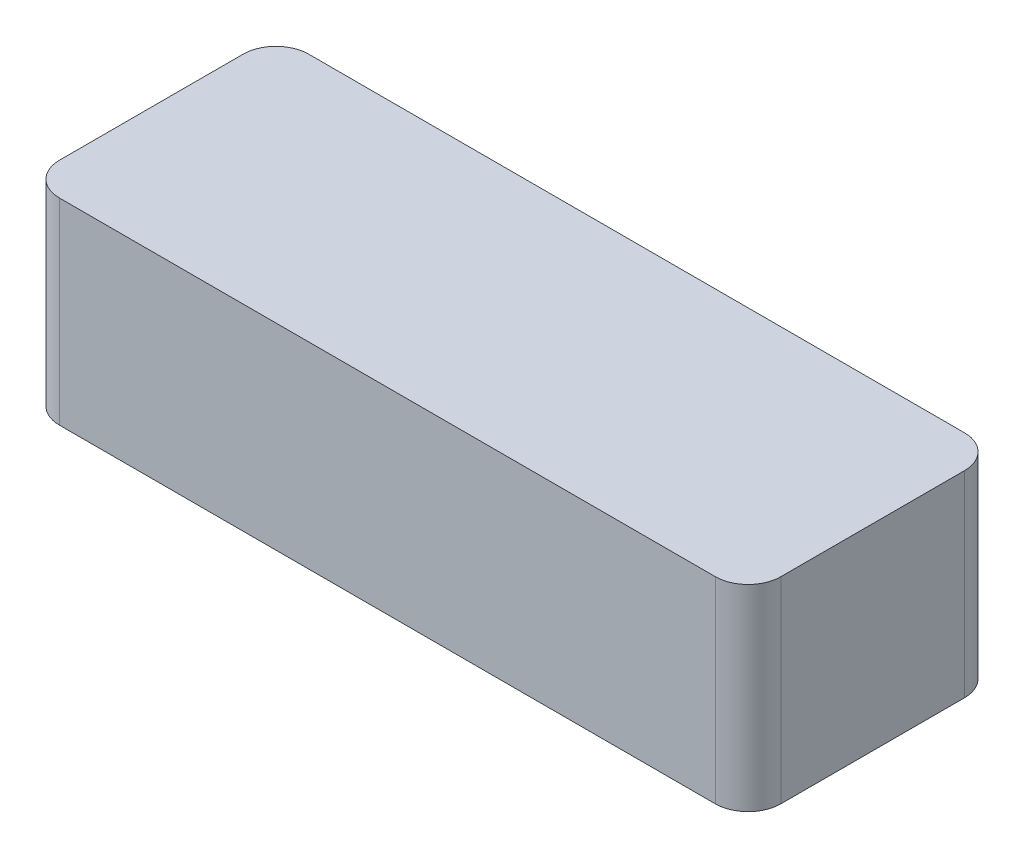
ISO-10303-21;
HEADER;
FILE_DESCRIPTION(('STEP AP214'),'2;1');
FILE_NAME('part.step','',(''),(''),'','','');
FILE_SCHEMA(('AUTOMOTIVE_DESIGN { 1 0 10303 214 1 1 1 1 }'));
ENDSEC;
DATA;
#1=APPLICATION_CONTEXT('core data for automotive mechanical design processes');
#2=APPLICATION_PROTOCOL_DEFINITION('international standard','automotive_design',2000,#1);
#3=PRODUCT_CONTEXT('',#1,'mechanical');
#4=PRODUCT('Part','Part','',(#3));
#5=PRODUCT_RELATED_PRODUCT_CATEGORY('part','',(#4));
#6=PRODUCT_DEFINITION_FORMATION('','',#4);
#7=PRODUCT_DEFINITION_CONTEXT('part definition',#1,'design');
#8=PRODUCT_DEFINITION('design','',#6,#7);
#9=PRODUCT_DEFINITION_SHAPE('','',#8);
#10=(LENGTH_UNIT() NAMED_UNIT(*) SI_UNIT(.MILLI.,.METRE.));
#11=(NAMED_UNIT(*) PLANE_ANGLE_UNIT() SI_UNIT($,.RADIAN.));
#12=(NAMED_UNIT(*) SI_UNIT($,.STERADIAN.) SOLID_ANGLE_UNIT());
#13=UNCERTAINTY_MEASURE_WITH_UNIT(LENGTH_MEASURE(1.E-05),#10,'distance_accuracy_value','');
#14=(GEOMETRIC_REPRESENTATION_CONTEXT(3) GLOBAL_UNCERTAINTY_ASSIGNED_CONTEXT((#13)) GLOBAL_UNIT_ASSIGNED_CONTEXT((#10,
#11,#12)) REPRESENTATION_CONTEXT('',''));
#15=CARTESIAN_POINT('',(0.,0.,0.));
#16=DIRECTION('',(0.,0.,1.));
#17=DIRECTION('',(1.,0.,0.));
#18=AXIS2_PLACEMENT_3D('',#15,#16,#17);
#19=CARTESIAN_POINT('',(-41.8004365761796,30.,9.48570595099183));
#20=DIRECTION('',(0.,-1.,0.));
#21=DIRECTION('',(0.,0.,-1.));
#22=AXIS2_PLACEMENT_3D('',#19,#20,#21);
#23=CYLINDRICAL_SURFACE('',#22,5.);
#24=CARTESIAN_POINT('',(-41.8004365761796,0.,9.48570595099183));
#25=DIRECTION('',(0.,1.,0.));
#26=DIRECTION('',(0.,0.,-1.));
#27=AXIS2_PLACEMENT_3D('',#24,#25,#26);
#28=CIRCLE('',#27,5.);
#29=CARTESIAN_POINT('',(-46.8004365761796,0.,9.48570595099179));
#30=VERTEX_POINT('',#29);
#31=CARTESIAN_POINT('',(-41.8004365761795,0.,14.4857059509918));
#32=VERTEX_POINT('',#31);
#33=EDGE_CURVE('E146',#30,#32,#28,.T.);
#34=ORIENTED_EDGE('',*,*,#33,.T.);
#35=DIRECTION('',(0.,-1.,0.));
#36=VECTOR('',#35,1.);
#37=CARTESIAN_POINT('',(-41.8004365761795,30.,14.4857059509918));
#38=LINE('',#37,#36);
#39=CARTESIAN_POINT('',(-41.8004365761795,30.,14.4857059509918));
#40=VERTEX_POINT('',#39);
#41=EDGE_CURVE('E11',#40,#32,#38,.T.);
#42=ORIENTED_EDGE('',*,*,#41,.F.);
#43=CARTESIAN_POINT('',(-41.8004365761796,30.,9.48570595099183));
#44=DIRECTION('',(0.,1.,0.));
#45=DIRECTION('',(0.,0.,-1.));
#46=AXIS2_PLACEMENT_3D('',#43,#44,#45);
#47=CIRCLE('',#46,5.);
#48=CARTESIAN_POINT('',(-46.8004365761796,30.,9.48570595099179));
#49=VERTEX_POINT('',#48);
#50=EDGE_CURVE('E168',#49,#40,#47,.T.);
#51=ORIENTED_EDGE('',*,*,#50,.F.);
#52=DIRECTION('',(0.,-1.,0.));
#53=VECTOR('',#52,1.);
#54=CARTESIAN_POINT('',(-46.8004365761796,30.,9.48570595099179));
#55=LINE('',#54,#53);
#56=EDGE_CURVE('E142',#49,#30,#55,.T.);
#57=ORIENTED_EDGE('',*,*,#56,.T.);
#58=EDGE_LOOP('',(#34,#42,#51,#57));
#59=FACE_BOUND('',#58,.T.);
#60=ADVANCED_FACE('F45',(#59),#23,.T.);
#61=CARTESIAN_POINT('',(-41.8004365761795,30.,14.4857059509918));
#62=DIRECTION('',(0.,0.,-1.));
#63=DIRECTION('',(-1.,0.,0.));
#64=AXIS2_PLACEMENT_3D('',#61,#62,#63);
#65=PLANE('',#64);
#66=DIRECTION('',(1.,0.,0.));
#67=VECTOR('',#66,1.);
#68=CARTESIAN_POINT('',(-41.8004365761795,0.,14.4857059509918));
#69=LINE('',#68,#67);
#70=CARTESIAN_POINT('',(58.1995634238204,0.,14.4857059509918));
#71=VERTEX_POINT('',#70);
#72=EDGE_CURVE('E150',#32,#71,#69,.T.);
#73=ORIENTED_EDGE('',*,*,#72,.T.);
#74=DIRECTION('',(0.,-1.,0.));
#75=VECTOR('',#74,1.);
#76=CARTESIAN_POINT('',(58.1995634238204,30.,14.4857059509918));
#77=LINE('',#76,#75);
#78=CARTESIAN_POINT('',(58.1995634238204,30.,14.4857059509918));
#79=VERTEX_POINT('',#78);
#80=EDGE_CURVE('E54',#79,#71,#77,.T.);
#81=ORIENTED_EDGE('',*,*,#80,.F.);
#82=DIRECTION('',(1.,0.,0.));
#83=VECTOR('',#82,1.);
#84=CARTESIAN_POINT('',(-41.8004365761795,30.,14.4857059509918));
#85=LINE('',#84,#83);
#86=EDGE_CURVE('E105',#40,#79,#85,.T.);
#87=ORIENTED_EDGE('',*,*,#86,.F.);
#88=ORIENTED_EDGE('',*,*,#41,.T.);
#89=EDGE_LOOP('',(#73,#81,#87,#88));
#90=FACE_BOUND('',#89,.T.);
#91=ADVANCED_FACE('F214',(#90),#65,.F.);
#92=CARTESIAN_POINT('',(58.1995634238204,30.,9.48570595099183));
#93=DIRECTION('',(0.,-1.,0.));
#94=DIRECTION('',(0.,0.,-1.));
#95=AXIS2_PLACEMENT_3D('',#92,#93,#94);
#96=CYLINDRICAL_SURFACE('',#95,5.);
#97=CARTESIAN_POINT('',(58.1995634238204,0.,9.48570595099183));
#98=DIRECTION('',(0.,1.,0.));
#99=DIRECTION('',(0.,0.,1.));
#100=AXIS2_PLACEMENT_3D('',#97,#98,#99);
#101=CIRCLE('',#100,5.);
#102=CARTESIAN_POINT('',(63.1995634238204,0.,9.48570595099183));
#103=VERTEX_POINT('',#102);
#104=EDGE_CURVE('E153',#71,#103,#101,.T.);
#105=ORIENTED_EDGE('',*,*,#104,.T.);
#106=DIRECTION('',(0.,-1.,0.));
#107=VECTOR('',#106,1.);
#108=CARTESIAN_POINT('',(63.1995634238204,30.,9.48570595099183));
#109=LINE('',#108,#107);
#110=CARTESIAN_POINT('',(63.1995634238204,30.,9.48570595099183));
#111=VERTEX_POINT('',#110);
#112=EDGE_CURVE('E179',#111,#103,#109,.T.);
#113=ORIENTED_EDGE('',*,*,#112,.F.);
#114=CARTESIAN_POINT('',(58.1995634238204,30.,9.48570595099183));
#115=DIRECTION('',(0.,1.,0.));
#116=DIRECTION('',(0.,0.,1.));
#117=AXIS2_PLACEMENT_3D('',#114,#115,#116);
#118=CIRCLE('',#117,5.);
#119=EDGE_CURVE('E189',#79,#111,#118,.T.);
#120=ORIENTED_EDGE('',*,*,#119,.F.);
#121=ORIENTED_EDGE('',*,*,#80,.T.);
#122=EDGE_LOOP('',(#105,#113,#120,#121));
#123=FACE_BOUND('',#122,.T.);
#124=ADVANCED_FACE('F187',(#123),#96,.T.);
#125=CARTESIAN_POINT('',(63.1995634238204,30.,9.48570595099183));
#126=DIRECTION('',(-1.,0.,0.));
#127=DIRECTION('',(0.,0.,1.));
#128=AXIS2_PLACEMENT_3D('',#125,#126,#127);
#129=PLANE('',#128);
#130=DIRECTION('',(0.,0.,-1.));
#131=VECTOR('',#130,1.);
#132=CARTESIAN_POINT('',(63.1995634238204,0.,9.48570595099183));
#133=LINE('',#132,#131);
#134=CARTESIAN_POINT('',(63.1995634238204,0.,-18.5142940490082));
#135=VERTEX_POINT('',#134);
#136=EDGE_CURVE('E156',#103,#135,#133,.T.);
#137=ORIENTED_EDGE('',*,*,#136,.T.);
#138=DIRECTION('',(0.,-1.,0.));
#139=VECTOR('',#138,1.);
#140=CARTESIAN_POINT('',(63.1995634238204,30.,-18.5142940490082));
#141=LINE('',#140,#139);
#142=CARTESIAN_POINT('',(63.1995634238204,30.,-18.5142940490082));
#143=VERTEX_POINT('',#142);
#144=EDGE_CURVE('E175',#143,#135,#141,.T.);
#145=ORIENTED_EDGE('',*,*,#144,.F.);
#146=DIRECTION('',(0.,0.,-1.));
#147=VECTOR('',#146,1.);
#148=CARTESIAN_POINT('',(63.1995634238204,30.,9.48570595099183));
#149=LINE('',#148,#147);
#150=EDGE_CURVE('E202',#111,#143,#149,.T.);
#151=ORIENTED_EDGE('',*,*,#150,.F.);
#152=ORIENTED_EDGE('',*,*,#112,.T.);
#153=EDGE_LOOP('',(#137,#145,#151,#152));
#154=FACE_BOUND('',#153,.T.);
#155=ADVANCED_FACE('F197',(#154),#129,.F.);
#156=CARTESIAN_POINT('',(58.1995634238204,30.,-18.5142940490082));
#157=DIRECTION('',(0.,-1.,0.));
#158=DIRECTION('',(0.,0.,-1.));
#159=AXIS2_PLACEMENT_3D('',#156,#157,#158);
#160=CYLINDRICAL_SURFACE('',#159,5.);
#161=CARTESIAN_POINT('',(58.1995634238204,0.,-18.5142940490082));
#162=DIRECTION('',(0.,1.,0.));
#163=DIRECTION('',(0.,0.,-1.));
#164=AXIS2_PLACEMENT_3D('',#161,#162,#163);
#165=CIRCLE('',#164,5.);
#166=CARTESIAN_POINT('',(58.1995634238204,0.,-23.5142940490082));
#167=VERTEX_POINT('',#166);
#168=EDGE_CURVE('E159',#135,#167,#165,.T.);
#169=ORIENTED_EDGE('',*,*,#168,.T.);
#170=DIRECTION('',(0.,-1.,0.));
#171=VECTOR('',#170,1.);
#172=CARTESIAN_POINT('',(58.1995634238204,30.,-23.5142940490082));
#173=LINE('',#172,#171);
#174=CARTESIAN_POINT('',(58.1995634238204,30.,-23.5142940490082));
#175=VERTEX_POINT('',#174);
#176=EDGE_CURVE('E135',#175,#167,#173,.T.);
#177=ORIENTED_EDGE('',*,*,#176,.F.);
#178=CARTESIAN_POINT('',(58.1995634238204,30.,-18.5142940490082));
#179=DIRECTION('',(0.,1.,0.));
#180=DIRECTION('',(0.,0.,-1.));
#181=AXIS2_PLACEMENT_3D('',#178,#179,#180);
#182=CIRCLE('',#181,5.);
#183=EDGE_CURVE('E124',#143,#175,#182,.T.);
#184=ORIENTED_EDGE('',*,*,#183,.F.);
#185=ORIENTED_EDGE('',*,*,#144,.T.);
#186=EDGE_LOOP('',(#169,#177,#184,#185));
#187=FACE_BOUND('',#186,.T.);
#188=ADVANCED_FACE('F200',(#187),#160,.T.);
#189=CARTESIAN_POINT('',(-41.8004365761796,30.,-23.5142940490082));
#190=DIRECTION('',(0.,0.,1.));
#191=DIRECTION('',(1.,0.,0.));
#192=AXIS2_PLACEMENT_3D('',#189,#190,#191);
#193=PLANE('',#192);
#194=DIRECTION('',(-1.,0.,0.));
#195=VECTOR('',#194,1.);
#196=CARTESIAN_POINT('',(-41.8004365761796,0.,-23.5142940490082));
#197=LINE('',#196,#195);
#198=CARTESIAN_POINT('',(-41.8004365761796,0.,-23.5142940490082));
#199=VERTEX_POINT('',#198);
#200=EDGE_CURVE('E133',#167,#199,#197,.T.);
#201=ORIENTED_EDGE('',*,*,#200,.T.);
#202=DIRECTION('',(0.,-1.,0.));
#203=VECTOR('',#202,1.);
#204=CARTESIAN_POINT('',(-41.8004365761796,30.,-23.5142940490082));
#205=LINE('',#204,#203);
#206=CARTESIAN_POINT('',(-41.8004365761796,30.,-23.5142940490082));
#207=VERTEX_POINT('',#206);
#208=EDGE_CURVE('E130',#207,#199,#205,.T.);
#209=ORIENTED_EDGE('',*,*,#208,.F.);
#210=DIRECTION('',(-1.,0.,0.));
#211=VECTOR('',#210,1.);
#212=CARTESIAN_POINT('',(-41.8004365761796,30.,-23.5142940490082));
#213=LINE('',#212,#211);
#214=EDGE_CURVE('E118',#175,#207,#213,.T.);
#215=ORIENTED_EDGE('',*,*,#214,.F.);
#216=ORIENTED_EDGE('',*,*,#176,.T.);
#217=EDGE_LOOP('',(#201,#209,#215,#216));
#218=FACE_BOUND('',#217,.T.);
#219=ADVANCED_FACE('F131',(#218),#193,.F.);
#220=CARTESIAN_POINT('',(-41.8004365761796,30.,-18.5142940490082));
#221=DIRECTION('',(0.,-1.,0.));
#222=DIRECTION('',(0.,0.,-1.));
#223=AXIS2_PLACEMENT_3D('',#220,#221,#222);
#224=CYLINDRICAL_SURFACE('',#223,5.);
#225=CARTESIAN_POINT('',(-41.8004365761796,0.,-18.5142940490082));
#226=DIRECTION('',(0.,1.,0.));
#227=DIRECTION('',(0.,0.,-1.));
#228=AXIS2_PLACEMENT_3D('',#225,#226,#227);
#229=CIRCLE('',#228,5.);
#230=CARTESIAN_POINT('',(-46.8004365761796,0.,-18.5142940490082));
#231=VERTEX_POINT('',#230);
#232=EDGE_CURVE('E91',#199,#231,#229,.T.);
#233=ORIENTED_EDGE('',*,*,#232,.T.);
#234=DIRECTION('',(0.,-1.,0.));
#235=VECTOR('',#234,1.);
#236=CARTESIAN_POINT('',(-46.8004365761796,30.,-18.5142940490082));
#237=LINE('',#236,#235);
#238=CARTESIAN_POINT('',(-46.8004365761796,30.,-18.5142940490082));
#239=VERTEX_POINT('',#238);
#240=EDGE_CURVE('E136',#239,#231,#237,.T.);
#241=ORIENTED_EDGE('',*,*,#240,.F.);
#242=CARTESIAN_POINT('',(-41.8004365761796,30.,-18.5142940490082));
#243=DIRECTION('',(0.,1.,0.));
#244=DIRECTION('',(0.,0.,-1.));
#245=AXIS2_PLACEMENT_3D('',#242,#243,#244);
#246=CIRCLE('',#245,5.);
#247=EDGE_CURVE('E122',#207,#239,#246,.T.);
#248=ORIENTED_EDGE('',*,*,#247,.F.);
#249=ORIENTED_EDGE('',*,*,#208,.T.);
#250=EDGE_LOOP('',(#233,#241,#248,#249));
#251=FACE_BOUND('',#250,.T.);
#252=ADVANCED_FACE('F138',(#251),#224,.T.);
#253=CARTESIAN_POINT('',(-46.8004365761796,30.,9.48570595099179));
#254=DIRECTION('',(1.,0.,0.));
#255=DIRECTION('',(0.,0.,-1.));
#256=AXIS2_PLACEMENT_3D('',#253,#254,#255);
#257=PLANE('',#256);
#258=DIRECTION('',(0.,0.,1.));
#259=VECTOR('',#258,1.);
#260=CARTESIAN_POINT('',(-46.8004365761796,0.,9.48570595099179));
#261=LINE('',#260,#259);
#262=EDGE_CURVE('E97',#231,#30,#261,.T.);
#263=ORIENTED_EDGE('',*,*,#262,.T.);
#264=ORIENTED_EDGE('',*,*,#56,.F.);
#265=DIRECTION('',(0.,0.,1.));
#266=VECTOR('',#265,1.);
#267=CARTESIAN_POINT('',(-46.8004365761796,30.,9.48570595099179));
#268=LINE('',#267,#266);
#269=EDGE_CURVE('E62',#239,#49,#268,.T.);
#270=ORIENTED_EDGE('',*,*,#269,.F.);
#271=ORIENTED_EDGE('',*,*,#240,.T.);
#272=EDGE_LOOP('',(#263,#264,#270,#271));
#273=FACE_BOUND('',#272,.T.);
#274=ADVANCED_FACE('F230',(#273),#257,.F.);
#275=CARTESIAN_POINT('',(-41.8004365761796,30.,9.48570595099183));
#276=DIRECTION('',(0.,-1.,0.));
#277=DIRECTION('',(0.,0.,-1.));
#278=AXIS2_PLACEMENT_3D('',#275,#276,#277);
#279=PLANE('',#278);
#280=ORIENTED_EDGE('',*,*,#50,.T.);
#281=ORIENTED_EDGE('',*,*,#86,.T.);
#282=ORIENTED_EDGE('',*,*,#119,.T.);
#283=ORIENTED_EDGE('',*,*,#150,.T.);
#284=ORIENTED_EDGE('',*,*,#183,.T.);
#285=ORIENTED_EDGE('',*,*,#214,.T.);
#286=ORIENTED_EDGE('',*,*,#247,.T.);
#287=ORIENTED_EDGE('',*,*,#269,.T.);
#288=EDGE_LOOP('',(#280,#281,#282,#283,#284,#285,#286,#287));
#289=FACE_BOUND('',#288,.T.);
#290=ADVANCED_FACE('F120',(#289),#279,.F.);
#291=CARTESIAN_POINT('',(-41.8004365761796,0.,9.48570595099183));
#292=DIRECTION('',(0.,-1.,0.));
#293=DIRECTION('',(0.,0.,-1.));
#294=AXIS2_PLACEMENT_3D('',#291,#292,#293);
#295=PLANE('',#294);
#296=ORIENTED_EDGE('',*,*,#33,.F.);
#297=ORIENTED_EDGE('',*,*,#262,.F.);
#298=ORIENTED_EDGE('',*,*,#232,.F.);
#299=ORIENTED_EDGE('',*,*,#200,.F.);
#300=ORIENTED_EDGE('',*,*,#168,.F.);
#301=ORIENTED_EDGE('',*,*,#136,.F.);
#302=ORIENTED_EDGE('',*,*,#104,.F.);
#303=ORIENTED_EDGE('',*,*,#72,.F.);
#304=EDGE_LOOP('',(#296,#297,#298,#299,#300,#301,#302,#303));
#305=FACE_BOUND('',#304,.T.);
#306=ADVANCED_FACE('F193',(#305),#295,.T.);
#307=CLOSED_SHELL('',(#60,#91,#124,#155,#188,#219,#252,#274,#290,#306));
#308=MANIFOLD_SOLID_BREP('B2',#307);
#309=ADVANCED_BREP_SHAPE_REPRESENTATION('',(#18,#308),#14);
#310=SHAPE_DEFINITION_REPRESENTATION(#9,#309);
ENDSEC;
END-ISO-10303-21;
